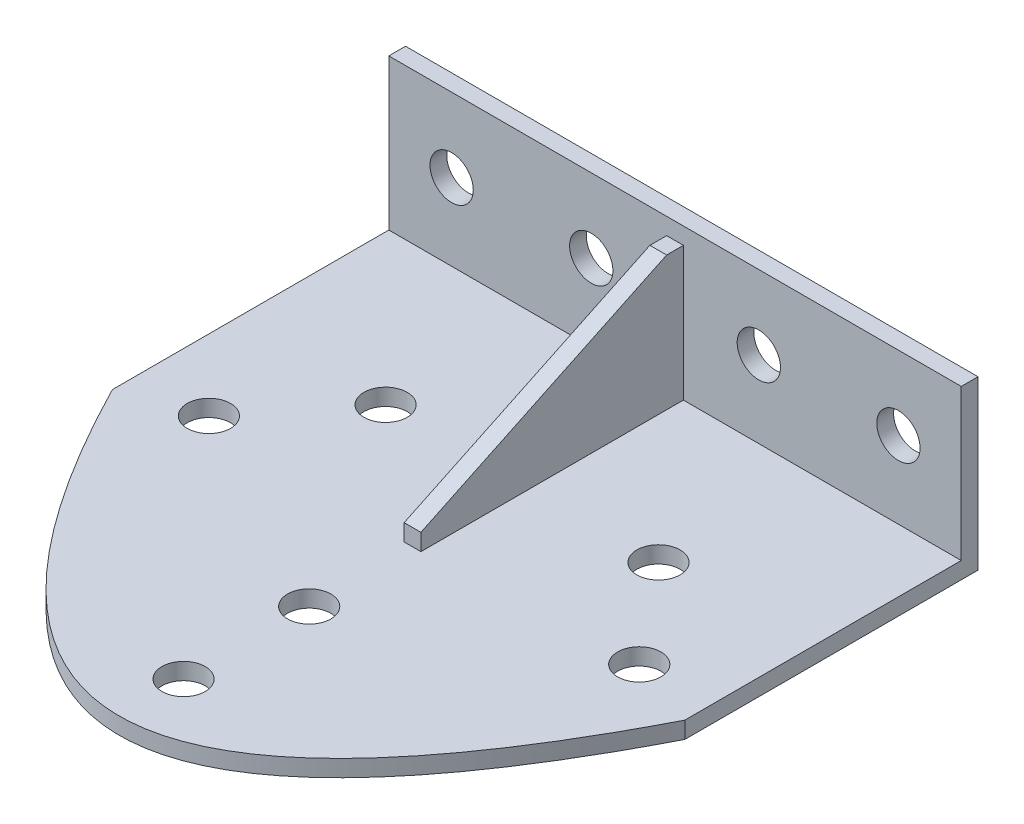
ISO-10303-21;
HEADER;
FILE_DESCRIPTION(('STEP AP214'),'2;1');
FILE_NAME('part.step','',(''),(''),'','','');
FILE_SCHEMA(('AUTOMOTIVE_DESIGN { 1 0 10303 214 1 1 1 1 }'));
ENDSEC;
DATA;
#1=APPLICATION_CONTEXT('core data for automotive mechanical design processes');
#2=APPLICATION_PROTOCOL_DEFINITION('international standard','automotive_design',2000,#1);
#3=PRODUCT_CONTEXT('',#1,'mechanical');
#4=PRODUCT('Part','Part','',(#3));
#5=PRODUCT_RELATED_PRODUCT_CATEGORY('part','',(#4));
#6=PRODUCT_DEFINITION_FORMATION('','',#4);
#7=PRODUCT_DEFINITION_CONTEXT('part definition',#1,'design');
#8=PRODUCT_DEFINITION('design','',#6,#7);
#9=PRODUCT_DEFINITION_SHAPE('','',#8);
#10=(LENGTH_UNIT() NAMED_UNIT(*) SI_UNIT(.MILLI.,.METRE.));
#11=(NAMED_UNIT(*) PLANE_ANGLE_UNIT() SI_UNIT($,.RADIAN.));
#12=(NAMED_UNIT(*) SI_UNIT($,.STERADIAN.) SOLID_ANGLE_UNIT());
#13=UNCERTAINTY_MEASURE_WITH_UNIT(LENGTH_MEASURE(1.E-05),#10,'distance_accuracy_value','');
#14=(GEOMETRIC_REPRESENTATION_CONTEXT(3) GLOBAL_UNCERTAINTY_ASSIGNED_CONTEXT((#13)) GLOBAL_UNIT_ASSIGNED_CONTEXT((#10,
#11,#12)) REPRESENTATION_CONTEXT('',''));
#15=CARTESIAN_POINT('',(0.,0.,0.));
#16=DIRECTION('',(0.,0.,1.));
#17=DIRECTION('',(1.,0.,0.));
#18=AXIS2_PLACEMENT_3D('',#15,#16,#17);
#19=CARTESIAN_POINT('',(0.,12.,410.));
#20=DIRECTION('',(0.,-1.,0.));
#21=DIRECTION('',(0.,0.,-1.));
#22=AXIS2_PLACEMENT_3D('',#19,#20,#21);
#23=PLANE('',#22);
#24=CARTESIAN_POINT('',(50.8743425491772,12.,191.732317868824));
#25=DIRECTION('',(0.,-1.,0.));
#26=DIRECTION('',(0.,0.,-1.));
#27=AXIS2_PLACEMENT_3D('',#24,#25,#26);
#28=CIRCLE('',#27,15.5);
#29=CARTESIAN_POINT('',(50.8743425491772,12.,176.232317868824));
#30=VERTEX_POINT('',#29);
#31=EDGE_CURVE('E261',#30,#30,#28,.T.);
#32=ORIENTED_EDGE('',*,*,#31,.T.);
#33=EDGE_LOOP('',(#32));
#34=FACE_BOUND('',#33,.T.);
#35=CARTESIAN_POINT('',(205.,12.,364.));
#36=DIRECTION('',(0.,1.,0.));
#37=DIRECTION('',(0.,0.,1.));
#38=AXIS2_PLACEMENT_3D('',#35,#36,#37);
#39=CIRCLE('',#38,15.5);
#40=CARTESIAN_POINT('',(205.,12.,379.5));
#41=VERTEX_POINT('',#40);
#42=EDGE_CURVE('E267',#41,#41,#39,.T.);
#43=ORIENTED_EDGE('',*,*,#42,.F.);
#44=EDGE_LOOP('',(#43));
#45=FACE_BOUND('',#44,.T.);
#46=CARTESIAN_POINT('',(107.261778201917,12.,121.586347916815));
#47=DIRECTION('',(0.,1.,0.));
#48=DIRECTION('',(0.,0.,1.));
#49=AXIS2_PLACEMENT_3D('',#46,#47,#48);
#50=CIRCLE('',#49,15.5);
#51=CARTESIAN_POINT('',(107.261778201917,12.,137.086347916815));
#52=VERTEX_POINT('',#51);
#53=EDGE_CURVE('E273',#52,#52,#50,.F.);
#54=ORIENTED_EDGE('',*,*,#53,.T.);
#55=EDGE_LOOP('',(#54));
#56=FACE_BOUND('',#55,.T.);
#57=CARTESIAN_POINT('',(205.,12.,274.));
#58=DIRECTION('',(0.,1.,0.));
#59=DIRECTION('',(0.,0.,1.));
#60=AXIS2_PLACEMENT_3D('',#57,#58,#59);
#61=CIRCLE('',#60,15.5);
#62=CARTESIAN_POINT('',(205.,12.,289.5));
#63=VERTEX_POINT('',#62);
#64=EDGE_CURVE('E255',#63,#63,#61,.T.);
#65=ORIENTED_EDGE('',*,*,#64,.F.);
#66=EDGE_LOOP('',(#65));
#67=FACE_BOUND('',#66,.T.);
#68=CARTESIAN_POINT('',(359.125657450823,12.,191.732317868824));
#69=DIRECTION('',(0.,1.,0.));
#70=DIRECTION('',(0.,0.,1.));
#71=AXIS2_PLACEMENT_3D('',#68,#69,#70);
#72=CIRCLE('',#71,15.5);
#73=CARTESIAN_POINT('',(359.125657450823,12.,207.232317868824));
#74=VERTEX_POINT('',#73);
#75=EDGE_CURVE('E249',#74,#74,#72,.T.);
#76=ORIENTED_EDGE('',*,*,#75,.F.);
#77=EDGE_LOOP('',(#76));
#78=FACE_BOUND('',#77,.T.);
#79=CARTESIAN_POINT('',(302.738221798083,12.,121.586347916815));
#80=DIRECTION('',(0.,1.,0.));
#81=DIRECTION('',(0.,0.,1.));
#82=AXIS2_PLACEMENT_3D('',#79,#80,#81);
#83=CIRCLE('',#82,15.5);
#84=CARTESIAN_POINT('',(302.738221798083,12.,137.086347916815));
#85=VERTEX_POINT('',#84);
#86=EDGE_CURVE('E243',#85,#85,#83,.T.);
#87=ORIENTED_EDGE('',*,*,#86,.F.);
#88=EDGE_LOOP('',(#87));
#89=FACE_BOUND('',#88,.T.);
#90=DIRECTION('',(0.,0.,-1.));
#91=VECTOR('',#90,1.);
#92=CARTESIAN_POINT('',(199.,12.,200.));
#93=LINE('',#92,#91);
#94=CARTESIAN_POINT('',(199.,12.,200.));
#95=VERTEX_POINT('',#94);
#96=CARTESIAN_POINT('',(199.,12.,12.));
#97=VERTEX_POINT('',#96);
#98=EDGE_CURVE('E241',#95,#97,#93,.T.);
#99=ORIENTED_EDGE('',*,*,#98,.T.);
#100=DIRECTION('',(-1.,0.,0.));
#101=VECTOR('',#100,1.);
#102=CARTESIAN_POINT('',(0.,12.,12.));
#103=LINE('',#102,#101);
#104=CARTESIAN_POINT('',(0.,12.,12.));
#105=VERTEX_POINT('',#104);
#106=EDGE_CURVE('E529',#97,#105,#103,.T.);
#107=ORIENTED_EDGE('',*,*,#106,.T.);
#108=DIRECTION('',(0.,0.,-1.));
#109=VECTOR('',#108,1.);
#110=CARTESIAN_POINT('',(0.,12.,410.));
#111=LINE('',#110,#109);
#112=CARTESIAN_POINT('',(0.,12.,210.));
#113=VERTEX_POINT('',#112);
#114=EDGE_CURVE('E521',#113,#105,#111,.T.);
#115=ORIENTED_EDGE('',*,*,#114,.F.);
#116=CARTESIAN_POINT('',(0.,12.,210.));
#117=CARTESIAN_POINT('',(205.,12.,610.));
#118=CARTESIAN_POINT('',(410.,12.,210.));
#119=B_SPLINE_CURVE_WITH_KNOTS('',2,(#116,#117,#118),.UNSPECIFIED.,.F.,.F.,(3,3),(0.,1.),.UNSPECIFIED.);
#120=CARTESIAN_POINT('',(410.,12.,210.));
#121=VERTEX_POINT('',#120);
#122=EDGE_CURVE('E279',#113,#121,#119,.T.);
#123=ORIENTED_EDGE('',*,*,#122,.T.);
#124=DIRECTION('',(0.,0.,-1.));
#125=VECTOR('',#124,1.);
#126=CARTESIAN_POINT('',(410.,12.,410.));
#127=LINE('',#126,#125);
#128=CARTESIAN_POINT('',(410.,12.,12.));
#129=VERTEX_POINT('',#128);
#130=EDGE_CURVE('E530',#121,#129,#127,.T.);
#131=ORIENTED_EDGE('',*,*,#130,.T.);
#132=CARTESIAN_POINT('',(211.,12.,12.));
#133=VERTEX_POINT('',#132);
#134=EDGE_CURVE('E531',#129,#133,#103,.T.);
#135=ORIENTED_EDGE('',*,*,#134,.T.);
#136=DIRECTION('',(0.,0.,-1.));
#137=VECTOR('',#136,1.);
#138=CARTESIAN_POINT('',(211.,12.,200.));
#139=LINE('',#138,#137);
#140=CARTESIAN_POINT('',(211.,12.,200.));
#141=VERTEX_POINT('',#140);
#142=EDGE_CURVE('E231',#141,#133,#139,.T.);
#143=ORIENTED_EDGE('',*,*,#142,.F.);
#144=DIRECTION('',(1.,0.,0.));
#145=VECTOR('',#144,1.);
#146=CARTESIAN_POINT('',(199.,12.,200.));
#147=LINE('',#146,#145);
#148=EDGE_CURVE('E234',#95,#141,#147,.T.);
#149=ORIENTED_EDGE('',*,*,#148,.F.);
#150=EDGE_LOOP('',(#99,#107,#115,#123,#131,#135,#143,#149));
#151=FACE_BOUND('',#150,.T.);
#152=ADVANCED_FACE('F128',(#34,#45,#56,#67,#78,#89,#151),#23,.F.);
#153=CARTESIAN_POINT('',(0.,120.,12.));
#154=DIRECTION('',(0.,0.,-1.));
#155=DIRECTION('',(-1.,0.,0.));
#156=AXIS2_PLACEMENT_3D('',#153,#154,#155);
#157=PLANE('',#156);
#158=CARTESIAN_POINT('',(265.,67.,12.));
#159=DIRECTION('',(0.,0.,1.));
#160=DIRECTION('',(1.,0.,0.));
#161=AXIS2_PLACEMENT_3D('',#158,#159,#160);
#162=CIRCLE('',#161,15.5);
#163=CARTESIAN_POINT('',(280.5,67.,12.));
#164=VERTEX_POINT('',#163);
#165=EDGE_CURVE('E613',#164,#164,#162,.T.);
#166=ORIENTED_EDGE('',*,*,#165,.F.);
#167=EDGE_LOOP('',(#166));
#168=FACE_BOUND('',#167,.T.);
#169=CARTESIAN_POINT('',(45.,67.,12.));
#170=DIRECTION('',(0.,0.,1.));
#171=DIRECTION('',(1.,0.,0.));
#172=AXIS2_PLACEMENT_3D('',#169,#170,#171);
#173=CIRCLE('',#172,15.5);
#174=CARTESIAN_POINT('',(60.5,67.,12.));
#175=VERTEX_POINT('',#174);
#176=EDGE_CURVE('E577',#175,#175,#173,.T.);
#177=ORIENTED_EDGE('',*,*,#176,.F.);
#178=EDGE_LOOP('',(#177));
#179=FACE_BOUND('',#178,.T.);
#180=CARTESIAN_POINT('',(145.,67.,12.));
#181=DIRECTION('',(0.,0.,1.));
#182=DIRECTION('',(1.,0.,0.));
#183=AXIS2_PLACEMENT_3D('',#180,#181,#182);
#184=CIRCLE('',#183,15.5);
#185=CARTESIAN_POINT('',(160.5,67.,12.));
#186=VERTEX_POINT('',#185);
#187=EDGE_CURVE('E618',#186,#186,#184,.T.);
#188=ORIENTED_EDGE('',*,*,#187,.F.);
#189=EDGE_LOOP('',(#188));
#190=FACE_BOUND('',#189,.T.);
#191=CARTESIAN_POINT('',(365.,67.,12.));
#192=DIRECTION('',(0.,0.,1.));
#193=DIRECTION('',(1.,0.,0.));
#194=AXIS2_PLACEMENT_3D('',#191,#192,#193);
#195=CIRCLE('',#194,15.5);
#196=CARTESIAN_POINT('',(380.5,67.,12.));
#197=VERTEX_POINT('',#196);
#198=EDGE_CURVE('E552',#197,#197,#195,.T.);
#199=ORIENTED_EDGE('',*,*,#198,.F.);
#200=EDGE_LOOP('',(#199));
#201=FACE_BOUND('',#200,.T.);
#202=DIRECTION('',(0.,-1.,0.));
#203=VECTOR('',#202,1.);
#204=CARTESIAN_POINT('',(199.,108.,12.));
#205=LINE('',#204,#203);
#206=CARTESIAN_POINT('',(199.,108.,12.));
#207=VERTEX_POINT('',#206);
#208=EDGE_CURVE('E602',#207,#97,#205,.T.);
#209=ORIENTED_EDGE('',*,*,#208,.F.);
#210=DIRECTION('',(-1.,0.,0.));
#211=VECTOR('',#210,1.);
#212=CARTESIAN_POINT('',(199.,108.,12.));
#213=LINE('',#212,#211);
#214=CARTESIAN_POINT('',(211.,108.,12.));
#215=VERTEX_POINT('',#214);
#216=EDGE_CURVE('E227',#215,#207,#213,.T.);
#217=ORIENTED_EDGE('',*,*,#216,.F.);
#218=DIRECTION('',(0.,1.,0.));
#219=VECTOR('',#218,1.);
#220=CARTESIAN_POINT('',(211.,108.,12.));
#221=LINE('',#220,#219);
#222=EDGE_CURVE('E597',#133,#215,#221,.T.);
#223=ORIENTED_EDGE('',*,*,#222,.F.);
#224=ORIENTED_EDGE('',*,*,#134,.F.);
#225=DIRECTION('',(0.,1.,0.));
#226=VECTOR('',#225,1.);
#227=CARTESIAN_POINT('',(410.,0.,12.));
#228=LINE('',#227,#226);
#229=CARTESIAN_POINT('',(410.,120.,12.));
#230=VERTEX_POINT('',#229);
#231=EDGE_CURVE('E544',#129,#230,#228,.T.);
#232=ORIENTED_EDGE('',*,*,#231,.T.);
#233=DIRECTION('',(-1.,0.,0.));
#234=VECTOR('',#233,1.);
#235=CARTESIAN_POINT('',(0.,120.,12.));
#236=LINE('',#235,#234);
#237=CARTESIAN_POINT('',(0.,120.,12.));
#238=VERTEX_POINT('',#237);
#239=EDGE_CURVE('E571',#230,#238,#236,.T.);
#240=ORIENTED_EDGE('',*,*,#239,.T.);
#241=DIRECTION('',(0.,-1.,0.));
#242=VECTOR('',#241,1.);
#243=CARTESIAN_POINT('',(0.,0.,12.));
#244=LINE('',#243,#242);
#245=EDGE_CURVE('E562',#238,#105,#244,.T.);
#246=ORIENTED_EDGE('',*,*,#245,.T.);
#247=ORIENTED_EDGE('',*,*,#106,.F.);
#248=EDGE_LOOP('',(#209,#217,#223,#224,#232,#240,#246,#247));
#249=FACE_BOUND('',#248,.T.);
#250=ADVANCED_FACE('F301',(#168,#179,#190,#201,#249),#157,.F.);
#251=CARTESIAN_POINT('',(0.,0.,12.));
#252=DIRECTION('',(0.,1.,0.));
#253=DIRECTION('',(0.,0.,1.));
#254=AXIS2_PLACEMENT_3D('',#251,#252,#253);
#255=PLANE('',#254);
#256=CARTESIAN_POINT('',(302.738221798083,0.,121.586347916815));
#257=DIRECTION('',(0.,1.,0.));
#258=DIRECTION('',(0.,0.,1.));
#259=AXIS2_PLACEMENT_3D('',#256,#257,#258);
#260=CIRCLE('',#259,15.5);
#261=CARTESIAN_POINT('',(302.738221798083,0.,137.086347916815));
#262=VERTEX_POINT('',#261);
#263=EDGE_CURVE('E246',#262,#262,#260,.T.);
#264=ORIENTED_EDGE('',*,*,#263,.T.);
#265=EDGE_LOOP('',(#264));
#266=FACE_BOUND('',#265,.T.);
#267=CARTESIAN_POINT('',(359.125657450823,0.,191.732317868824));
#268=DIRECTION('',(0.,1.,0.));
#269=DIRECTION('',(0.,0.,1.));
#270=AXIS2_PLACEMENT_3D('',#267,#268,#269);
#271=CIRCLE('',#270,15.5);
#272=CARTESIAN_POINT('',(359.125657450823,0.,207.232317868824));
#273=VERTEX_POINT('',#272);
#274=EDGE_CURVE('E252',#273,#273,#271,.T.);
#275=ORIENTED_EDGE('',*,*,#274,.T.);
#276=EDGE_LOOP('',(#275));
#277=FACE_BOUND('',#276,.T.);
#278=CARTESIAN_POINT('',(205.,0.,274.));
#279=DIRECTION('',(0.,1.,0.));
#280=DIRECTION('',(0.,0.,1.));
#281=AXIS2_PLACEMENT_3D('',#278,#279,#280);
#282=CIRCLE('',#281,15.5);
#283=CARTESIAN_POINT('',(205.,0.,289.5));
#284=VERTEX_POINT('',#283);
#285=EDGE_CURVE('E258',#284,#284,#282,.T.);
#286=ORIENTED_EDGE('',*,*,#285,.T.);
#287=EDGE_LOOP('',(#286));
#288=FACE_BOUND('',#287,.T.);
#289=CARTESIAN_POINT('',(107.261778201917,0.,121.586347916815));
#290=DIRECTION('',(0.,1.,0.));
#291=DIRECTION('',(0.,0.,1.));
#292=AXIS2_PLACEMENT_3D('',#289,#290,#291);
#293=CIRCLE('',#292,15.5);
#294=CARTESIAN_POINT('',(107.261778201917,0.,137.086347916815));
#295=VERTEX_POINT('',#294);
#296=EDGE_CURVE('E276',#295,#295,#293,.F.);
#297=ORIENTED_EDGE('',*,*,#296,.F.);
#298=EDGE_LOOP('',(#297));
#299=FACE_BOUND('',#298,.T.);
#300=DIRECTION('',(0.,0.,-1.));
#301=VECTOR('',#300,1.);
#302=CARTESIAN_POINT('',(410.,0.,12.));
#303=LINE('',#302,#301);
#304=CARTESIAN_POINT('',(410.,0.,210.));
#305=VERTEX_POINT('',#304);
#306=CARTESIAN_POINT('',(410.,0.,0.));
#307=VERTEX_POINT('',#306);
#308=EDGE_CURVE('E349',#305,#307,#303,.T.);
#309=ORIENTED_EDGE('',*,*,#308,.F.);
#310=CARTESIAN_POINT('',(0.,0.,210.));
#311=CARTESIAN_POINT('',(205.,0.,610.));
#312=CARTESIAN_POINT('',(410.,0.,210.));
#313=B_SPLINE_CURVE_WITH_KNOTS('',2,(#310,#311,#312),.UNSPECIFIED.,.F.,.F.,(3,3),(0.,1.),.UNSPECIFIED.);
#314=CARTESIAN_POINT('',(0.,0.,210.));
#315=VERTEX_POINT('',#314);
#316=EDGE_CURVE('E525',#315,#305,#313,.T.);
#317=ORIENTED_EDGE('',*,*,#316,.F.);
#318=DIRECTION('',(0.,0.,-1.));
#319=VECTOR('',#318,1.);
#320=CARTESIAN_POINT('',(0.,0.,12.));
#321=LINE('',#320,#319);
#322=CARTESIAN_POINT('',(0.,0.,0.));
#323=VERTEX_POINT('',#322);
#324=EDGE_CURVE('E524',#315,#323,#321,.T.);
#325=ORIENTED_EDGE('',*,*,#324,.T.);
#326=DIRECTION('',(1.,0.,0.));
#327=VECTOR('',#326,1.);
#328=CARTESIAN_POINT('',(0.,0.,0.));
#329=LINE('',#328,#327);
#330=EDGE_CURVE('E576',#323,#307,#329,.T.);
#331=ORIENTED_EDGE('',*,*,#330,.T.);
#332=EDGE_LOOP('',(#309,#317,#325,#331));
#333=FACE_BOUND('',#332,.T.);
#334=CARTESIAN_POINT('',(205.,0.,364.));
#335=DIRECTION('',(0.,1.,0.));
#336=DIRECTION('',(0.,0.,1.));
#337=AXIS2_PLACEMENT_3D('',#334,#335,#336);
#338=CIRCLE('',#337,15.5);
#339=CARTESIAN_POINT('',(205.,0.,379.5));
#340=VERTEX_POINT('',#339);
#341=EDGE_CURVE('E270',#340,#340,#338,.T.);
#342=ORIENTED_EDGE('',*,*,#341,.T.);
#343=EDGE_LOOP('',(#342));
#344=FACE_BOUND('',#343,.T.);
#345=CARTESIAN_POINT('',(50.8743425491772,0.,191.732317868824));
#346=DIRECTION('',(0.,1.,0.));
#347=DIRECTION('',(0.,0.,1.));
#348=AXIS2_PLACEMENT_3D('',#345,#346,#347);
#349=CIRCLE('',#348,15.5);
#350=CARTESIAN_POINT('',(50.8743425491772,0.,207.232317868824));
#351=VERTEX_POINT('',#350);
#352=EDGE_CURVE('E264',#351,#351,#349,.F.);
#353=ORIENTED_EDGE('',*,*,#352,.F.);
#354=EDGE_LOOP('',(#353));
#355=FACE_BOUND('',#354,.T.);
#356=ADVANCED_FACE('F321',(#266,#277,#288,#299,#333,#344,#355),#255,.F.);
#357=CARTESIAN_POINT('',(410.,0.,12.));
#358=DIRECTION('',(-1.,0.,0.));
#359=DIRECTION('',(0.,0.,1.));
#360=AXIS2_PLACEMENT_3D('',#357,#358,#359);
#361=PLANE('',#360);
#362=DIRECTION('',(0.,1.,0.));
#363=VECTOR('',#362,1.);
#364=CARTESIAN_POINT('',(410.,-186.,210.));
#365=LINE('',#364,#363);
#366=EDGE_CURVE('E136',#305,#121,#365,.T.);
#367=ORIENTED_EDGE('',*,*,#366,.F.);
#368=ORIENTED_EDGE('',*,*,#308,.T.);
#369=DIRECTION('',(0.,1.,0.));
#370=VECTOR('',#369,1.);
#371=CARTESIAN_POINT('',(410.,0.,0.));
#372=LINE('',#371,#370);
#373=CARTESIAN_POINT('',(410.,120.,0.));
#374=VERTEX_POINT('',#373);
#375=EDGE_CURVE('E579',#307,#374,#372,.T.);
#376=ORIENTED_EDGE('',*,*,#375,.T.);
#377=DIRECTION('',(0.,0.,-1.));
#378=VECTOR('',#377,1.);
#379=CARTESIAN_POINT('',(410.,120.,12.));
#380=LINE('',#379,#378);
#381=EDGE_CURVE('E559',#230,#374,#380,.T.);
#382=ORIENTED_EDGE('',*,*,#381,.F.);
#383=ORIENTED_EDGE('',*,*,#231,.F.);
#384=ORIENTED_EDGE('',*,*,#130,.F.);
#385=EDGE_LOOP('',(#367,#368,#376,#382,#383,#384));
#386=FACE_BOUND('',#385,.T.);
#387=ADVANCED_FACE('F330',(#386),#361,.F.);
#388=CARTESIAN_POINT('',(0.,0.,12.));
#389=DIRECTION('',(1.,0.,0.));
#390=DIRECTION('',(0.,0.,-1.));
#391=AXIS2_PLACEMENT_3D('',#388,#389,#390);
#392=PLANE('',#391);
#393=DIRECTION('',(0.,1.,0.));
#394=VECTOR('',#393,1.);
#395=CARTESIAN_POINT('',(0.,-186.,210.));
#396=LINE('',#395,#394);
#397=EDGE_CURVE('E518',#315,#113,#396,.T.);
#398=ORIENTED_EDGE('',*,*,#397,.T.);
#399=ORIENTED_EDGE('',*,*,#114,.T.);
#400=ORIENTED_EDGE('',*,*,#245,.F.);
#401=DIRECTION('',(0.,0.,-1.));
#402=VECTOR('',#401,1.);
#403=CARTESIAN_POINT('',(0.,120.,12.));
#404=LINE('',#403,#402);
#405=CARTESIAN_POINT('',(0.,120.,0.));
#406=VERTEX_POINT('',#405);
#407=EDGE_CURVE('E573',#238,#406,#404,.T.);
#408=ORIENTED_EDGE('',*,*,#407,.T.);
#409=DIRECTION('',(0.,-1.,0.));
#410=VECTOR('',#409,1.);
#411=CARTESIAN_POINT('',(0.,0.,0.));
#412=LINE('',#411,#410);
#413=EDGE_CURVE('E574',#406,#323,#412,.T.);
#414=ORIENTED_EDGE('',*,*,#413,.T.);
#415=ORIENTED_EDGE('',*,*,#324,.F.);
#416=EDGE_LOOP('',(#398,#399,#400,#408,#414,#415));
#417=FACE_BOUND('',#416,.T.);
#418=ADVANCED_FACE('F130',(#417),#392,.F.);
#419=CARTESIAN_POINT('',(0.,120.,0.));
#420=DIRECTION('',(0.,0.,-1.));
#421=DIRECTION('',(-1.,0.,0.));
#422=AXIS2_PLACEMENT_3D('',#419,#420,#421);
#423=PLANE('',#422);
#424=CARTESIAN_POINT('',(265.,67.,0.));
#425=DIRECTION('',(0.,0.,1.));
#426=DIRECTION('',(1.,0.,0.));
#427=AXIS2_PLACEMENT_3D('',#424,#425,#426);
#428=CIRCLE('',#427,15.5);
#429=CARTESIAN_POINT('',(280.5,67.,0.));
#430=VERTEX_POINT('',#429);
#431=EDGE_CURVE('E611',#430,#430,#428,.T.);
#432=ORIENTED_EDGE('',*,*,#431,.T.);
#433=EDGE_LOOP('',(#432));
#434=FACE_BOUND('',#433,.T.);
#435=CARTESIAN_POINT('',(45.,67.,0.));
#436=DIRECTION('',(0.,0.,1.));
#437=DIRECTION('',(1.,0.,0.));
#438=AXIS2_PLACEMENT_3D('',#435,#436,#437);
#439=CIRCLE('',#438,15.5);
#440=CARTESIAN_POINT('',(60.5,67.,0.));
#441=VERTEX_POINT('',#440);
#442=EDGE_CURVE('E567',#441,#441,#439,.T.);
#443=ORIENTED_EDGE('',*,*,#442,.T.);
#444=EDGE_LOOP('',(#443));
#445=FACE_BOUND('',#444,.T.);
#446=ORIENTED_EDGE('',*,*,#413,.F.);
#447=DIRECTION('',(-1.,0.,0.));
#448=VECTOR('',#447,1.);
#449=CARTESIAN_POINT('',(0.,120.,0.));
#450=LINE('',#449,#448);
#451=EDGE_CURVE('E564',#374,#406,#450,.T.);
#452=ORIENTED_EDGE('',*,*,#451,.F.);
#453=ORIENTED_EDGE('',*,*,#375,.F.);
#454=ORIENTED_EDGE('',*,*,#330,.F.);
#455=EDGE_LOOP('',(#446,#452,#453,#454));
#456=FACE_BOUND('',#455,.T.);
#457=CARTESIAN_POINT('',(145.,67.,0.));
#458=DIRECTION('',(0.,0.,1.));
#459=DIRECTION('',(1.,0.,0.));
#460=AXIS2_PLACEMENT_3D('',#457,#458,#459);
#461=CIRCLE('',#460,15.5);
#462=CARTESIAN_POINT('',(160.5,67.,0.));
#463=VERTEX_POINT('',#462);
#464=EDGE_CURVE('E606',#463,#463,#461,.T.);
#465=ORIENTED_EDGE('',*,*,#464,.T.);
#466=EDGE_LOOP('',(#465));
#467=FACE_BOUND('',#466,.T.);
#468=CARTESIAN_POINT('',(365.,67.,0.));
#469=DIRECTION('',(0.,0.,1.));
#470=DIRECTION('',(1.,0.,0.));
#471=AXIS2_PLACEMENT_3D('',#468,#469,#470);
#472=CIRCLE('',#471,15.5);
#473=CARTESIAN_POINT('',(380.5,67.,0.));
#474=VERTEX_POINT('',#473);
#475=EDGE_CURVE('E533',#474,#474,#472,.T.);
#476=ORIENTED_EDGE('',*,*,#475,.T.);
#477=EDGE_LOOP('',(#476));
#478=FACE_BOUND('',#477,.T.);
#479=ADVANCED_FACE('F323',(#434,#445,#456,#467,#478),#423,.T.);
#480=CARTESIAN_POINT('',(0.,120.,12.));
#481=DIRECTION('',(0.,-1.,0.));
#482=DIRECTION('',(1.,0.,0.));
#483=AXIS2_PLACEMENT_3D('',#480,#481,#482);
#484=PLANE('',#483);
#485=ORIENTED_EDGE('',*,*,#451,.T.);
#486=ORIENTED_EDGE('',*,*,#407,.F.);
#487=ORIENTED_EDGE('',*,*,#239,.F.);
#488=ORIENTED_EDGE('',*,*,#381,.T.);
#489=EDGE_LOOP('',(#485,#486,#487,#488));
#490=FACE_BOUND('',#489,.T.);
#491=ADVANCED_FACE('F317',(#490),#484,.F.);
#492=CARTESIAN_POINT('',(45.,67.,12.));
#493=DIRECTION('',(0.,0.,-1.));
#494=DIRECTION('',(-1.,0.,0.));
#495=AXIS2_PLACEMENT_3D('',#492,#493,#494);
#496=CYLINDRICAL_SURFACE('',#495,15.5);
#497=ORIENTED_EDGE('',*,*,#176,.T.);
#498=EDGE_LOOP('',(#497));
#499=FACE_BOUND('',#498,.T.);
#500=ORIENTED_EDGE('',*,*,#442,.F.);
#501=EDGE_LOOP('',(#500));
#502=FACE_BOUND('',#501,.T.);
#503=ADVANCED_FACE('F313',(#499,#502),#496,.F.);
#504=CARTESIAN_POINT('',(145.,67.,12.));
#505=DIRECTION('',(0.,0.,-1.));
#506=DIRECTION('',(-1.,0.,0.));
#507=AXIS2_PLACEMENT_3D('',#504,#505,#506);
#508=CYLINDRICAL_SURFACE('',#507,15.5);
#509=ORIENTED_EDGE('',*,*,#187,.T.);
#510=EDGE_LOOP('',(#509));
#511=FACE_BOUND('',#510,.T.);
#512=ORIENTED_EDGE('',*,*,#464,.F.);
#513=EDGE_LOOP('',(#512));
#514=FACE_BOUND('',#513,.T.);
#515=ADVANCED_FACE('F309',(#511,#514),#508,.F.);
#516=CARTESIAN_POINT('',(265.,67.,12.));
#517=DIRECTION('',(0.,0.,-1.));
#518=DIRECTION('',(-1.,0.,0.));
#519=AXIS2_PLACEMENT_3D('',#516,#517,#518);
#520=CYLINDRICAL_SURFACE('',#519,15.5);
#521=ORIENTED_EDGE('',*,*,#165,.T.);
#522=EDGE_LOOP('',(#521));
#523=FACE_BOUND('',#522,.T.);
#524=ORIENTED_EDGE('',*,*,#431,.F.);
#525=EDGE_LOOP('',(#524));
#526=FACE_BOUND('',#525,.T.);
#527=ADVANCED_FACE('F305',(#523,#526),#520,.F.);
#528=CARTESIAN_POINT('',(365.,67.,12.));
#529=DIRECTION('',(0.,0.,-1.));
#530=DIRECTION('',(-1.,0.,0.));
#531=AXIS2_PLACEMENT_3D('',#528,#529,#530);
#532=CYLINDRICAL_SURFACE('',#531,15.5);
#533=ORIENTED_EDGE('',*,*,#198,.T.);
#534=EDGE_LOOP('',(#533));
#535=FACE_BOUND('',#534,.T.);
#536=ORIENTED_EDGE('',*,*,#475,.F.);
#537=EDGE_LOOP('',(#536));
#538=FACE_BOUND('',#537,.T.);
#539=ADVANCED_FACE('F296',(#535,#538),#532,.F.);
#540=CARTESIAN_POINT('',(0.,-186.,210.));
#541=CARTESIAN_POINT('',(205.,-186.,610.));
#542=CARTESIAN_POINT('',(410.,-186.,210.));
#543=B_SPLINE_CURVE_WITH_KNOTS('',2,(#540,#541,#542),.UNSPECIFIED.,.F.,.F.,(3,3),(0.,1.),.UNSPECIFIED.);
#544=DIRECTION('',(0.,1.,0.));
#545=VECTOR('',#544,1.);
#546=SURFACE_OF_LINEAR_EXTRUSION('',#543,#545);
#547=ORIENTED_EDGE('',*,*,#316,.T.);
#548=ORIENTED_EDGE('',*,*,#366,.T.);
#549=ORIENTED_EDGE('',*,*,#122,.F.);
#550=ORIENTED_EDGE('',*,*,#397,.F.);
#551=EDGE_LOOP('',(#547,#548,#549,#550));
#552=FACE_BOUND('',#551,.T.);
#553=ADVANCED_FACE('F291',(#552),#546,.T.);
#554=CARTESIAN_POINT('',(107.261778201917,-186.,121.586347916815));
#555=DIRECTION('',(0.,1.,0.));
#556=DIRECTION('',(0.,0.,1.));
#557=AXIS2_PLACEMENT_3D('',#554,#555,#556);
#558=CYLINDRICAL_SURFACE('',#557,15.5);
#559=ORIENTED_EDGE('',*,*,#53,.F.);
#560=EDGE_LOOP('',(#559));
#561=FACE_BOUND('',#560,.T.);
#562=ORIENTED_EDGE('',*,*,#296,.T.);
#563=EDGE_LOOP('',(#562));
#564=FACE_BOUND('',#563,.T.);
#565=ADVANCED_FACE('F295',(#561,#564),#558,.F.);
#566=CARTESIAN_POINT('',(205.,-186.,364.));
#567=DIRECTION('',(0.,1.,0.));
#568=DIRECTION('',(0.,0.,1.));
#569=AXIS2_PLACEMENT_3D('',#566,#567,#568);
#570=CYLINDRICAL_SURFACE('',#569,15.5);
#571=ORIENTED_EDGE('',*,*,#42,.T.);
#572=EDGE_LOOP('',(#571));
#573=FACE_BOUND('',#572,.T.);
#574=ORIENTED_EDGE('',*,*,#341,.F.);
#575=EDGE_LOOP('',(#574));
#576=FACE_BOUND('',#575,.T.);
#577=ADVANCED_FACE('F357',(#573,#576),#570,.F.);
#578=CARTESIAN_POINT('',(50.8743425491772,-186.,191.732317868824));
#579=DIRECTION('',(0.,1.,0.));
#580=DIRECTION('',(0.,0.,1.));
#581=AXIS2_PLACEMENT_3D('',#578,#579,#580);
#582=CYLINDRICAL_SURFACE('',#581,15.5);
#583=ORIENTED_EDGE('',*,*,#31,.F.);
#584=EDGE_LOOP('',(#583));
#585=FACE_BOUND('',#584,.T.);
#586=ORIENTED_EDGE('',*,*,#352,.T.);
#587=EDGE_LOOP('',(#586));
#588=FACE_BOUND('',#587,.T.);
#589=ADVANCED_FACE('F354',(#585,#588),#582,.F.);
#590=CARTESIAN_POINT('',(205.,-186.,274.));
#591=DIRECTION('',(0.,1.,0.));
#592=DIRECTION('',(0.,0.,1.));
#593=AXIS2_PLACEMENT_3D('',#590,#591,#592);
#594=CYLINDRICAL_SURFACE('',#593,15.5);
#595=ORIENTED_EDGE('',*,*,#64,.T.);
#596=EDGE_LOOP('',(#595));
#597=FACE_BOUND('',#596,.T.);
#598=ORIENTED_EDGE('',*,*,#285,.F.);
#599=EDGE_LOOP('',(#598));
#600=FACE_BOUND('',#599,.T.);
#601=ADVANCED_FACE('F356',(#597,#600),#594,.F.);
#602=CARTESIAN_POINT('',(359.125657450823,-186.,191.732317868824));
#603=DIRECTION('',(0.,1.,0.));
#604=DIRECTION('',(0.,0.,1.));
#605=AXIS2_PLACEMENT_3D('',#602,#603,#604);
#606=CYLINDRICAL_SURFACE('',#605,15.5);
#607=ORIENTED_EDGE('',*,*,#75,.T.);
#608=EDGE_LOOP('',(#607));
#609=FACE_BOUND('',#608,.T.);
#610=ORIENTED_EDGE('',*,*,#274,.F.);
#611=EDGE_LOOP('',(#610));
#612=FACE_BOUND('',#611,.T.);
#613=ADVANCED_FACE('F364',(#609,#612),#606,.F.);
#614=CARTESIAN_POINT('',(302.738221798083,-186.,121.586347916815));
#615=DIRECTION('',(0.,1.,0.));
#616=DIRECTION('',(0.,0.,1.));
#617=AXIS2_PLACEMENT_3D('',#614,#615,#616);
#618=CYLINDRICAL_SURFACE('',#617,15.5);
#619=ORIENTED_EDGE('',*,*,#86,.T.);
#620=EDGE_LOOP('',(#619));
#621=FACE_BOUND('',#620,.T.);
#622=ORIENTED_EDGE('',*,*,#263,.F.);
#623=EDGE_LOOP('',(#622));
#624=FACE_BOUND('',#623,.T.);
#625=ADVANCED_FACE('F372',(#621,#624),#618,.F.);
#626=CARTESIAN_POINT('',(199.,108.,200.));
#627=DIRECTION('',(1.,0.,0.));
#628=DIRECTION('',(0.,0.,-1.));
#629=AXIS2_PLACEMENT_3D('',#626,#627,#628);
#630=PLANE('',#629);
#631=DIRECTION('',(0.,-1.,0.));
#632=VECTOR('',#631,1.);
#633=CARTESIAN_POINT('',(199.,108.,200.));
#634=LINE('',#633,#632);
#635=CARTESIAN_POINT('',(199.,24.,200.));
#636=VERTEX_POINT('',#635);
#637=EDGE_CURVE('E149',#636,#95,#634,.T.);
#638=ORIENTED_EDGE('',*,*,#637,.F.);
#639=DIRECTION('',(0.,-0.430729586214938,0.90248103778368));
#640=VECTOR('',#639,1.);
#641=CARTESIAN_POINT('',(199.,24.,200.));
#642=LINE('',#641,#640);
#643=CARTESIAN_POINT('',(199.,108.,24.));
#644=VERTEX_POINT('',#643);
#645=EDGE_CURVE('E142',#644,#636,#642,.T.);
#646=ORIENTED_EDGE('',*,*,#645,.F.);
#647=DIRECTION('',(0.,0.,-1.));
#648=VECTOR('',#647,1.);
#649=CARTESIAN_POINT('',(199.,108.,200.));
#650=LINE('',#649,#648);
#651=EDGE_CURVE('E220',#644,#207,#650,.T.);
#652=ORIENTED_EDGE('',*,*,#651,.T.);
#653=ORIENTED_EDGE('',*,*,#208,.T.);
#654=ORIENTED_EDGE('',*,*,#98,.F.);
#655=EDGE_LOOP('',(#638,#646,#652,#653,#654));
#656=FACE_BOUND('',#655,.T.);
#657=ADVANCED_FACE('F218',(#656),#630,.F.);
#658=CARTESIAN_POINT('',(211.,108.,200.));
#659=DIRECTION('',(-1.,0.,0.));
#660=DIRECTION('',(0.,0.,1.));
#661=AXIS2_PLACEMENT_3D('',#658,#659,#660);
#662=PLANE('',#661);
#663=DIRECTION('',(0.,0.,-1.));
#664=VECTOR('',#663,1.);
#665=CARTESIAN_POINT('',(211.,108.,200.));
#666=LINE('',#665,#664);
#667=CARTESIAN_POINT('',(211.,108.,24.));
#668=VERTEX_POINT('',#667);
#669=EDGE_CURVE('E228',#668,#215,#666,.T.);
#670=ORIENTED_EDGE('',*,*,#669,.F.);
#671=DIRECTION('',(0.,-0.430729586214938,0.90248103778368));
#672=VECTOR('',#671,1.);
#673=CARTESIAN_POINT('',(211.,39.5843500210349,167.347076146403));
#674=LINE('',#673,#672);
#675=CARTESIAN_POINT('',(211.,24.,200.));
#676=VERTEX_POINT('',#675);
#677=EDGE_CURVE('E212',#668,#676,#674,.T.);
#678=ORIENTED_EDGE('',*,*,#677,.T.);
#679=DIRECTION('',(0.,1.,0.));
#680=VECTOR('',#679,1.);
#681=CARTESIAN_POINT('',(211.,108.,200.));
#682=LINE('',#681,#680);
#683=EDGE_CURVE('E229',#141,#676,#682,.T.);
#684=ORIENTED_EDGE('',*,*,#683,.F.);
#685=ORIENTED_EDGE('',*,*,#142,.T.);
#686=ORIENTED_EDGE('',*,*,#222,.T.);
#687=EDGE_LOOP('',(#670,#678,#684,#685,#686));
#688=FACE_BOUND('',#687,.T.);
#689=ADVANCED_FACE('F379',(#688),#662,.F.);
#690=CARTESIAN_POINT('',(199.,108.,200.));
#691=DIRECTION('',(0.,-1.,0.));
#692=DIRECTION('',(1.,0.,0.));
#693=AXIS2_PLACEMENT_3D('',#690,#691,#692);
#694=PLANE('',#693);
#695=ORIENTED_EDGE('',*,*,#651,.F.);
#696=DIRECTION('',(-1.,0.,0.));
#697=VECTOR('',#696,1.);
#698=CARTESIAN_POINT('',(387.,108.,24.));
#699=LINE('',#698,#697);
#700=EDGE_CURVE('E209',#668,#644,#699,.T.);
#701=ORIENTED_EDGE('',*,*,#700,.F.);
#702=ORIENTED_EDGE('',*,*,#669,.T.);
#703=ORIENTED_EDGE('',*,*,#216,.T.);
#704=EDGE_LOOP('',(#695,#701,#702,#703));
#705=FACE_BOUND('',#704,.T.);
#706=ADVANCED_FACE('F225',(#705),#694,.F.);
#707=CARTESIAN_POINT('',(199.,12.,200.));
#708=DIRECTION('',(0.,0.,1.));
#709=DIRECTION('',(1.,0.,0.));
#710=AXIS2_PLACEMENT_3D('',#707,#708,#709);
#711=PLANE('',#710);
#712=DIRECTION('',(1.,0.,0.));
#713=VECTOR('',#712,1.);
#714=CARTESIAN_POINT('',(199.,24.,200.));
#715=LINE('',#714,#713);
#716=EDGE_CURVE('E12',#636,#676,#715,.T.);
#717=ORIENTED_EDGE('',*,*,#716,.F.);
#718=ORIENTED_EDGE('',*,*,#637,.T.);
#719=ORIENTED_EDGE('',*,*,#148,.T.);
#720=ORIENTED_EDGE('',*,*,#683,.T.);
#721=EDGE_LOOP('',(#717,#718,#719,#720));
#722=FACE_BOUND('',#721,.T.);
#723=ADVANCED_FACE('F385',(#722),#711,.T.);
#724=CARTESIAN_POINT('',(387.,24.,200.));
#725=DIRECTION('',(0.,-0.90248103778368,-0.430729586214938));
#726=DIRECTION('',(0.,0.430729586214938,-0.90248103778368));
#727=AXIS2_PLACEMENT_3D('',#724,#725,#726);
#728=PLANE('',#727);
#729=ORIENTED_EDGE('',*,*,#700,.T.);
#730=ORIENTED_EDGE('',*,*,#645,.T.);
#731=ORIENTED_EDGE('',*,*,#716,.T.);
#732=ORIENTED_EDGE('',*,*,#677,.F.);
#733=EDGE_LOOP('',(#729,#730,#731,#732));
#734=FACE_BOUND('',#733,.T.);
#735=ADVANCED_FACE('F210',(#734),#728,.F.);
#736=CLOSED_SHELL('',(#152,#250,#356,#387,#418,#479,#491,#503,#515,#527,#539,#553,#565,#577,
#589,#601,#613,#625,#657,#689,#706,#723,#735));
#737=MANIFOLD_SOLID_BREP('B2',#736);
#738=ADVANCED_BREP_SHAPE_REPRESENTATION('',(#18,#737),#14);
#739=SHAPE_DEFINITION_REPRESENTATION(#9,#738);
ENDSEC;
END-ISO-10303-21;
